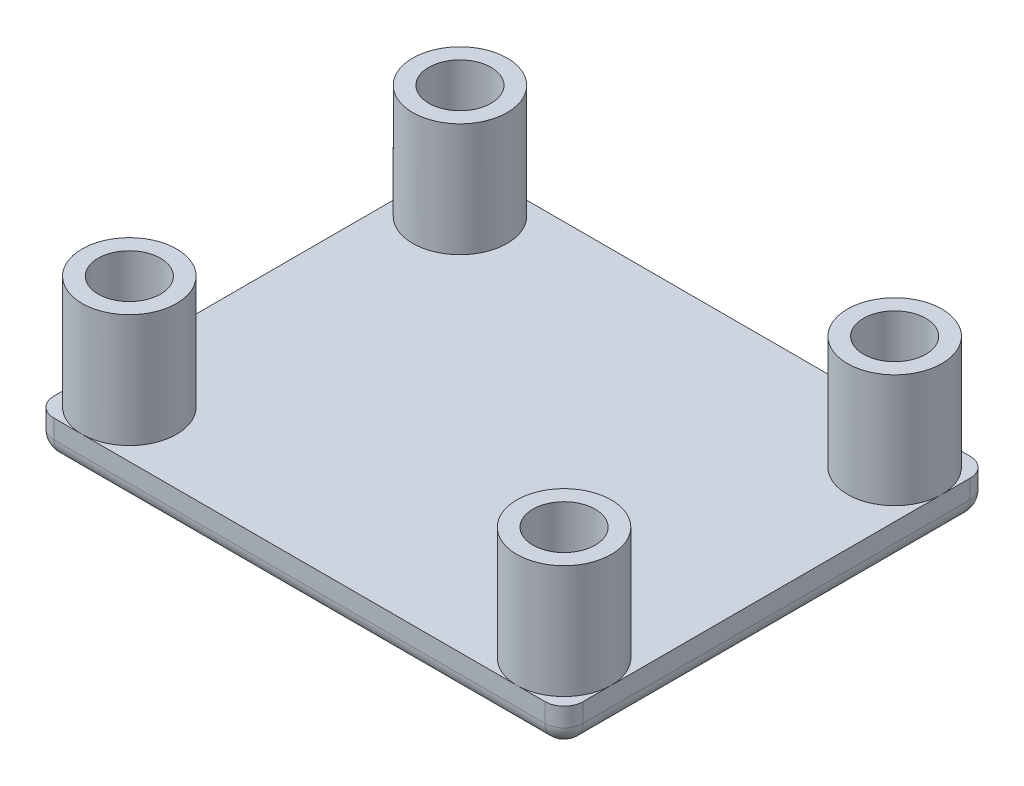
ISO-10303-21;
HEADER;
FILE_DESCRIPTION(('STEP AP214'),'2;1');
FILE_NAME('part.step','',(''),(''),'','','');
FILE_SCHEMA(('AUTOMOTIVE_DESIGN { 1 0 10303 214 1 1 1 1 }'));
ENDSEC;
DATA;
#1=APPLICATION_CONTEXT('core data for automotive mechanical design processes');
#2=APPLICATION_PROTOCOL_DEFINITION('international standard','automotive_design',2000,#1);
#3=PRODUCT_CONTEXT('',#1,'mechanical');
#4=PRODUCT('Part','Part','',(#3));
#5=PRODUCT_RELATED_PRODUCT_CATEGORY('part','',(#4));
#6=PRODUCT_DEFINITION_FORMATION('','',#4);
#7=PRODUCT_DEFINITION_CONTEXT('part definition',#1,'design');
#8=PRODUCT_DEFINITION('design','',#6,#7);
#9=PRODUCT_DEFINITION_SHAPE('','',#8);
#10=(LENGTH_UNIT() NAMED_UNIT(*) SI_UNIT(.MILLI.,.METRE.));
#11=(NAMED_UNIT(*) PLANE_ANGLE_UNIT() SI_UNIT($,.RADIAN.));
#12=(NAMED_UNIT(*) SI_UNIT($,.STERADIAN.) SOLID_ANGLE_UNIT());
#13=UNCERTAINTY_MEASURE_WITH_UNIT(LENGTH_MEASURE(1.E-05),#10,'distance_accuracy_value','');
#14=(GEOMETRIC_REPRESENTATION_CONTEXT(3) GLOBAL_UNCERTAINTY_ASSIGNED_CONTEXT((#13)) GLOBAL_UNIT_ASSIGNED_CONTEXT((#10,
#11,#12)) REPRESENTATION_CONTEXT('',''));
#15=CARTESIAN_POINT('',(0.,0.,0.));
#16=DIRECTION('',(0.,0.,1.));
#17=DIRECTION('',(1.,0.,0.));
#18=AXIS2_PLACEMENT_3D('',#15,#16,#17);
#19=CARTESIAN_POINT('',(0.,2.,0.));
#20=DIRECTION('',(0.,-1.,0.));
#21=DIRECTION('',(0.,0.,-1.));
#22=AXIS2_PLACEMENT_3D('',#19,#20,#21);
#23=PLANE('',#22);
#24=DIRECTION('',(0.,0.,1.));
#25=VECTOR('',#24,1.);
#26=CARTESIAN_POINT('',(-14.005,2.,11.25));
#27=LINE('',#26,#25);
#28=CARTESIAN_POINT('',(-14.005,2.,8.75));
#29=VERTEX_POINT('',#28);
#30=CARTESIAN_POINT('',(-14.005,2.,10.25));
#31=VERTEX_POINT('',#30);
#32=EDGE_CURVE('E149',#29,#31,#27,.T.);
#33=ORIENTED_EDGE('',*,*,#32,.T.);
#34=CARTESIAN_POINT('',(-13.005,2.,10.25));
#35=DIRECTION('',(0.,-1.,0.));
#36=DIRECTION('',(0.,0.,-1.));
#37=AXIS2_PLACEMENT_3D('',#34,#35,#36);
#38=CIRCLE('',#37,1.);
#39=CARTESIAN_POINT('',(-13.005,2.,11.25));
#40=VERTEX_POINT('',#39);
#41=EDGE_CURVE('E44',#31,#40,#38,.F.);
#42=ORIENTED_EDGE('',*,*,#41,.T.);
#43=DIRECTION('',(1.,0.,0.));
#44=VECTOR('',#43,1.);
#45=CARTESIAN_POINT('',(-14.005,2.,11.25));
#46=LINE('',#45,#44);
#47=CARTESIAN_POINT('',(-11.505,2.,11.25));
#48=VERTEX_POINT('',#47);
#49=EDGE_CURVE('E159',#40,#48,#46,.T.);
#50=ORIENTED_EDGE('',*,*,#49,.T.);
#51=CARTESIAN_POINT('',(-11.505,2.,8.75));
#52=DIRECTION('',(0.,1.,0.));
#53=DIRECTION('',(0.,0.,1.));
#54=AXIS2_PLACEMENT_3D('',#51,#52,#53);
#55=CIRCLE('',#54,2.5);
#56=EDGE_CURVE('E157',#29,#48,#55,.T.);
#57=ORIENTED_EDGE('',*,*,#56,.F.);
#58=EDGE_LOOP('',(#33,#42,#50,#57));
#59=FACE_BOUND('',#58,.T.);
#60=ADVANCED_FACE('F35',(#59),#23,.F.);
#61=CARTESIAN_POINT('',(11.505,2.,11.25));
#62=VERTEX_POINT('',#61);
#63=CARTESIAN_POINT('',(13.005,2.,11.25));
#64=VERTEX_POINT('',#63);
#65=EDGE_CURVE('E194',#62,#64,#46,.T.);
#66=ORIENTED_EDGE('',*,*,#65,.T.);
#67=CARTESIAN_POINT('',(13.005,2.,10.25));
#68=DIRECTION('',(0.,-1.,0.));
#69=DIRECTION('',(0.,0.,-1.));
#70=AXIS2_PLACEMENT_3D('',#67,#68,#69);
#71=CIRCLE('',#70,1.);
#72=CARTESIAN_POINT('',(14.005,2.,10.25));
#73=VERTEX_POINT('',#72);
#74=EDGE_CURVE('E257',#64,#73,#71,.F.);
#75=ORIENTED_EDGE('',*,*,#74,.T.);
#76=DIRECTION('',(0.,0.,-1.));
#77=VECTOR('',#76,1.);
#78=CARTESIAN_POINT('',(14.005,2.,11.25));
#79=LINE('',#78,#77);
#80=CARTESIAN_POINT('',(14.005,2.,8.75));
#81=VERTEX_POINT('',#80);
#82=EDGE_CURVE('E188',#73,#81,#79,.T.);
#83=ORIENTED_EDGE('',*,*,#82,.T.);
#84=CARTESIAN_POINT('',(11.505,2.,8.75));
#85=DIRECTION('',(0.,1.,0.));
#86=DIRECTION('',(0.,0.,1.));
#87=AXIS2_PLACEMENT_3D('',#84,#85,#86);
#88=CIRCLE('',#87,2.5);
#89=EDGE_CURVE('E174',#62,#81,#88,.T.);
#90=ORIENTED_EDGE('',*,*,#89,.F.);
#91=EDGE_LOOP('',(#66,#75,#83,#90));
#92=FACE_BOUND('',#91,.T.);
#93=ADVANCED_FACE('F328',(#92),#23,.F.);
#94=EDGE_CURVE('E143',#48,#29,#55,.T.);
#95=ORIENTED_EDGE('',*,*,#94,.F.);
#96=EDGE_CURVE('E196',#48,#62,#46,.T.);
#97=ORIENTED_EDGE('',*,*,#96,.T.);
#98=EDGE_CURVE('E166',#81,#62,#88,.T.);
#99=ORIENTED_EDGE('',*,*,#98,.F.);
#100=CARTESIAN_POINT('',(14.005,2.,-8.75));
#101=VERTEX_POINT('',#100);
#102=EDGE_CURVE('E191',#81,#101,#79,.T.);
#103=ORIENTED_EDGE('',*,*,#102,.T.);
#104=CARTESIAN_POINT('',(11.505,2.,-8.75));
#105=DIRECTION('',(0.,-1.,0.));
#106=DIRECTION('',(0.,0.,-1.));
#107=AXIS2_PLACEMENT_3D('',#104,#105,#106);
#108=CIRCLE('',#107,2.5);
#109=CARTESIAN_POINT('',(11.505,2.,-11.25));
#110=VERTEX_POINT('',#109);
#111=EDGE_CURVE('E197',#110,#101,#108,.F.);
#112=ORIENTED_EDGE('',*,*,#111,.F.);
#113=DIRECTION('',(-1.,0.,0.));
#114=VECTOR('',#113,1.);
#115=CARTESIAN_POINT('',(-14.005,2.,-11.25));
#116=LINE('',#115,#114);
#117=CARTESIAN_POINT('',(-11.505,2.,-11.25));
#118=VERTEX_POINT('',#117);
#119=EDGE_CURVE('E192',#110,#118,#116,.T.);
#120=ORIENTED_EDGE('',*,*,#119,.T.);
#121=CARTESIAN_POINT('',(-11.505,2.,-8.75));
#122=DIRECTION('',(0.,1.,0.));
#123=DIRECTION('',(0.,0.,1.));
#124=AXIS2_PLACEMENT_3D('',#121,#122,#123);
#125=CIRCLE('',#124,2.5);
#126=CARTESIAN_POINT('',(-14.005,2.,-8.75));
#127=VERTEX_POINT('',#126);
#128=EDGE_CURVE('E146',#127,#118,#125,.T.);
#129=ORIENTED_EDGE('',*,*,#128,.F.);
#130=EDGE_CURVE('E140',#127,#29,#27,.T.);
#131=ORIENTED_EDGE('',*,*,#130,.T.);
#132=EDGE_LOOP('',(#95,#97,#99,#103,#112,#120,#129,#131));
#133=FACE_BOUND('',#132,.T.);
#134=ADVANCED_FACE('F141',(#133),#23,.F.);
#135=CARTESIAN_POINT('',(-13.005,2.,-11.25));
#136=VERTEX_POINT('',#135);
#137=EDGE_CURVE('E190',#118,#136,#116,.T.);
#138=ORIENTED_EDGE('',*,*,#137,.T.);
#139=CARTESIAN_POINT('',(-13.005,2.,-10.25));
#140=DIRECTION('',(0.,-1.,0.));
#141=DIRECTION('',(0.,0.,-1.));
#142=AXIS2_PLACEMENT_3D('',#139,#140,#141);
#143=CIRCLE('',#142,1.);
#144=CARTESIAN_POINT('',(-14.005,2.,-10.25));
#145=VERTEX_POINT('',#144);
#146=EDGE_CURVE('E11',#136,#145,#143,.F.);
#147=ORIENTED_EDGE('',*,*,#146,.T.);
#148=EDGE_CURVE('E148',#145,#127,#27,.T.);
#149=ORIENTED_EDGE('',*,*,#148,.T.);
#150=EDGE_CURVE('E180',#118,#127,#125,.T.);
#151=ORIENTED_EDGE('',*,*,#150,.F.);
#152=EDGE_LOOP('',(#138,#147,#149,#151));
#153=FACE_BOUND('',#152,.T.);
#154=ADVANCED_FACE('F368',(#153),#23,.F.);
#155=CARTESIAN_POINT('',(14.005,2.,11.25));
#156=DIRECTION('',(-1.,0.,0.));
#157=DIRECTION('',(0.,0.,1.));
#158=AXIS2_PLACEMENT_3D('',#155,#156,#157);
#159=PLANE('',#158);
#160=DIRECTION('',(0.,0.,-1.));
#161=VECTOR('',#160,1.);
#162=CARTESIAN_POINT('',(14.005,1.,-11.25));
#163=LINE('',#162,#161);
#164=CARTESIAN_POINT('',(14.005,1.,10.25));
#165=VERTEX_POINT('',#164);
#166=CARTESIAN_POINT('',(14.005,1.,-10.25));
#167=VERTEX_POINT('',#166);
#168=EDGE_CURVE('E200',#165,#167,#163,.T.);
#169=ORIENTED_EDGE('',*,*,#168,.T.);
#170=DIRECTION('',(0.,-1.,0.));
#171=VECTOR('',#170,1.);
#172=CARTESIAN_POINT('',(14.005,2.,-10.25));
#173=LINE('',#172,#171);
#174=CARTESIAN_POINT('',(14.005,2.,-10.25));
#175=VERTEX_POINT('',#174);
#176=EDGE_CURVE('E249',#167,#175,#173,.F.);
#177=ORIENTED_EDGE('',*,*,#176,.T.);
#178=EDGE_CURVE('E186',#101,#175,#79,.T.);
#179=ORIENTED_EDGE('',*,*,#178,.F.);
#180=ORIENTED_EDGE('',*,*,#102,.F.);
#181=ORIENTED_EDGE('',*,*,#82,.F.);
#182=DIRECTION('',(0.,-1.,0.));
#183=VECTOR('',#182,1.);
#184=CARTESIAN_POINT('',(14.005,2.,10.25));
#185=LINE('',#184,#183);
#186=EDGE_CURVE('E247',#73,#165,#185,.T.);
#187=ORIENTED_EDGE('',*,*,#186,.T.);
#188=EDGE_LOOP('',(#169,#177,#179,#180,#181,#187));
#189=FACE_BOUND('',#188,.T.);
#190=ADVANCED_FACE('F336',(#189),#159,.F.);
#191=CARTESIAN_POINT('',(-14.005,2.,-11.25));
#192=DIRECTION('',(0.,0.,1.));
#193=DIRECTION('',(1.,0.,0.));
#194=AXIS2_PLACEMENT_3D('',#191,#192,#193);
#195=PLANE('',#194);
#196=CARTESIAN_POINT('',(13.005,2.,-11.25));
#197=VERTEX_POINT('',#196);
#198=EDGE_CURVE('E155',#197,#110,#116,.T.);
#199=ORIENTED_EDGE('',*,*,#198,.F.);
#200=DIRECTION('',(0.,-1.,0.));
#201=VECTOR('',#200,1.);
#202=CARTESIAN_POINT('',(13.005,2.,-11.25));
#203=LINE('',#202,#201);
#204=CARTESIAN_POINT('',(13.005,1.,-11.25));
#205=VERTEX_POINT('',#204);
#206=EDGE_CURVE('E245',#197,#205,#203,.T.);
#207=ORIENTED_EDGE('',*,*,#206,.T.);
#208=DIRECTION('',(-1.,0.,0.));
#209=VECTOR('',#208,1.);
#210=CARTESIAN_POINT('',(-14.005,1.,-11.25));
#211=LINE('',#210,#209);
#212=CARTESIAN_POINT('',(-13.005,1.,-11.25));
#213=VERTEX_POINT('',#212);
#214=EDGE_CURVE('E215',#205,#213,#211,.T.);
#215=ORIENTED_EDGE('',*,*,#214,.T.);
#216=DIRECTION('',(0.,-1.,0.));
#217=VECTOR('',#216,1.);
#218=CARTESIAN_POINT('',(-13.005,2.,-11.25));
#219=LINE('',#218,#217);
#220=EDGE_CURVE('E243',#213,#136,#219,.F.);
#221=ORIENTED_EDGE('',*,*,#220,.T.);
#222=ORIENTED_EDGE('',*,*,#137,.F.);
#223=ORIENTED_EDGE('',*,*,#119,.F.);
#224=EDGE_LOOP('',(#199,#207,#215,#221,#222,#223));
#225=FACE_BOUND('',#224,.T.);
#226=ADVANCED_FACE('F289',(#225),#195,.F.);
#227=CARTESIAN_POINT('',(-14.005,2.,11.25));
#228=DIRECTION('',(1.,0.,0.));
#229=DIRECTION('',(0.,0.,-1.));
#230=AXIS2_PLACEMENT_3D('',#227,#228,#229);
#231=PLANE('',#230);
#232=DIRECTION('',(0.,0.,1.));
#233=VECTOR('',#232,1.);
#234=CARTESIAN_POINT('',(-14.005,1.,11.25));
#235=LINE('',#234,#233);
#236=CARTESIAN_POINT('',(-14.005,1.,-10.25));
#237=VERTEX_POINT('',#236);
#238=CARTESIAN_POINT('',(-14.005,1.,10.25));
#239=VERTEX_POINT('',#238);
#240=EDGE_CURVE('E218',#237,#239,#235,.T.);
#241=ORIENTED_EDGE('',*,*,#240,.T.);
#242=DIRECTION('',(0.,-1.,0.));
#243=VECTOR('',#242,1.);
#244=CARTESIAN_POINT('',(-14.005,2.,10.25));
#245=LINE('',#244,#243);
#246=EDGE_CURVE('E58',#239,#31,#245,.F.);
#247=ORIENTED_EDGE('',*,*,#246,.T.);
#248=ORIENTED_EDGE('',*,*,#32,.F.);
#249=ORIENTED_EDGE('',*,*,#130,.F.);
#250=ORIENTED_EDGE('',*,*,#148,.F.);
#251=DIRECTION('',(0.,-1.,0.));
#252=VECTOR('',#251,1.);
#253=CARTESIAN_POINT('',(-14.005,2.,-10.25));
#254=LINE('',#253,#252);
#255=EDGE_CURVE('E259',#145,#237,#254,.T.);
#256=ORIENTED_EDGE('',*,*,#255,.T.);
#257=EDGE_LOOP('',(#241,#247,#248,#249,#250,#256));
#258=FACE_BOUND('',#257,.T.);
#259=ADVANCED_FACE('F152',(#258),#231,.F.);
#260=CARTESIAN_POINT('',(-14.005,2.,11.25));
#261=DIRECTION('',(0.,0.,-1.));
#262=DIRECTION('',(-1.,0.,0.));
#263=AXIS2_PLACEMENT_3D('',#260,#261,#262);
#264=PLANE('',#263);
#265=DIRECTION('',(1.,0.,0.));
#266=VECTOR('',#265,1.);
#267=CARTESIAN_POINT('',(14.005,1.,11.25));
#268=LINE('',#267,#266);
#269=CARTESIAN_POINT('',(-13.005,1.,11.25));
#270=VERTEX_POINT('',#269);
#271=CARTESIAN_POINT('',(13.005,1.,11.25));
#272=VERTEX_POINT('',#271);
#273=EDGE_CURVE('E220',#270,#272,#268,.T.);
#274=ORIENTED_EDGE('',*,*,#273,.T.);
#275=DIRECTION('',(0.,-1.,0.));
#276=VECTOR('',#275,1.);
#277=CARTESIAN_POINT('',(13.005,2.,11.25));
#278=LINE('',#277,#276);
#279=EDGE_CURVE('E255',#272,#64,#278,.F.);
#280=ORIENTED_EDGE('',*,*,#279,.T.);
#281=ORIENTED_EDGE('',*,*,#65,.F.);
#282=ORIENTED_EDGE('',*,*,#96,.F.);
#283=ORIENTED_EDGE('',*,*,#49,.F.);
#284=DIRECTION('',(0.,-1.,0.));
#285=VECTOR('',#284,1.);
#286=CARTESIAN_POINT('',(-13.005,2.,11.25));
#287=LINE('',#286,#285);
#288=EDGE_CURVE('E253',#40,#270,#287,.T.);
#289=ORIENTED_EDGE('',*,*,#288,.T.);
#290=EDGE_LOOP('',(#274,#280,#281,#282,#283,#289));
#291=FACE_BOUND('',#290,.T.);
#292=ADVANCED_FACE('F321',(#291),#264,.F.);
#293=ORIENTED_EDGE('',*,*,#178,.T.);
#294=CARTESIAN_POINT('',(13.005,2.,-10.25));
#295=DIRECTION('',(0.,-1.,0.));
#296=DIRECTION('',(0.,0.,-1.));
#297=AXIS2_PLACEMENT_3D('',#294,#295,#296);
#298=CIRCLE('',#297,1.);
#299=EDGE_CURVE('E251',#175,#197,#298,.F.);
#300=ORIENTED_EDGE('',*,*,#299,.T.);
#301=ORIENTED_EDGE('',*,*,#198,.T.);
#302=CARTESIAN_POINT('',(11.505,2.,-8.75));
#303=DIRECTION('',(0.,1.,0.));
#304=DIRECTION('',(0.,0.,1.));
#305=AXIS2_PLACEMENT_3D('',#302,#303,#304);
#306=CIRCLE('',#305,2.5);
#307=EDGE_CURVE('E173',#101,#110,#306,.T.);
#308=ORIENTED_EDGE('',*,*,#307,.F.);
#309=EDGE_LOOP('',(#293,#300,#301,#308));
#310=FACE_BOUND('',#309,.T.);
#311=ADVANCED_FACE('F360',(#310),#23,.F.);
#312=CARTESIAN_POINT('',(0.,0.,0.));
#313=DIRECTION('',(0.,-1.,0.));
#314=DIRECTION('',(0.,0.,-1.));
#315=AXIS2_PLACEMENT_3D('',#312,#313,#314);
#316=PLANE('',#315);
#317=DIRECTION('',(-1.,0.,0.));
#318=VECTOR('',#317,1.);
#319=CARTESIAN_POINT('',(14.005,0.,-10.25));
#320=LINE('',#319,#318);
#321=CARTESIAN_POINT('',(-13.005,0.,-10.25));
#322=VERTEX_POINT('',#321);
#323=CARTESIAN_POINT('',(13.005,0.,-10.25));
#324=VERTEX_POINT('',#323);
#325=EDGE_CURVE('E209',#322,#324,#320,.F.);
#326=ORIENTED_EDGE('',*,*,#325,.T.);
#327=DIRECTION('',(0.,0.,-1.));
#328=VECTOR('',#327,1.);
#329=CARTESIAN_POINT('',(13.005,0.,11.25));
#330=LINE('',#329,#328);
#331=CARTESIAN_POINT('',(13.005,0.,10.25));
#332=VERTEX_POINT('',#331);
#333=EDGE_CURVE('E212',#324,#332,#330,.F.);
#334=ORIENTED_EDGE('',*,*,#333,.T.);
#335=DIRECTION('',(1.,0.,0.));
#336=VECTOR('',#335,1.);
#337=CARTESIAN_POINT('',(-14.005,0.,10.25));
#338=LINE('',#337,#336);
#339=CARTESIAN_POINT('',(-13.005,0.,10.25));
#340=VERTEX_POINT('',#339);
#341=EDGE_CURVE('E203',#332,#340,#338,.F.);
#342=ORIENTED_EDGE('',*,*,#341,.T.);
#343=DIRECTION('',(0.,0.,1.));
#344=VECTOR('',#343,1.);
#345=CARTESIAN_POINT('',(-13.005,0.,-11.25));
#346=LINE('',#345,#344);
#347=EDGE_CURVE('E206',#340,#322,#346,.F.);
#348=ORIENTED_EDGE('',*,*,#347,.T.);
#349=EDGE_LOOP('',(#326,#334,#342,#348));
#350=FACE_BOUND('',#349,.T.);
#351=ADVANCED_FACE('F302',(#350),#316,.T.);
#352=CARTESIAN_POINT('',(-11.505,8.,-8.75));
#353=DIRECTION('',(0.,-1.,0.));
#354=DIRECTION('',(0.,0.,-1.));
#355=AXIS2_PLACEMENT_3D('',#352,#353,#354);
#356=CYLINDRICAL_SURFACE('',#355,2.5);
#357=CARTESIAN_POINT('',(-11.505,8.,-8.75));
#358=DIRECTION('',(0.,1.,0.));
#359=DIRECTION('',(0.,0.,1.));
#360=AXIS2_PLACEMENT_3D('',#357,#358,#359);
#361=CIRCLE('',#360,2.5);
#362=CARTESIAN_POINT('',(-11.505,8.,-6.25));
#363=VERTEX_POINT('',#362);
#364=EDGE_CURVE('E183',#363,#363,#361,.T.);
#365=ORIENTED_EDGE('',*,*,#364,.F.);
#366=EDGE_LOOP('',(#365));
#367=FACE_BOUND('',#366,.T.);
#368=ORIENTED_EDGE('',*,*,#150,.T.);
#369=ORIENTED_EDGE('',*,*,#128,.T.);
#370=EDGE_LOOP('',(#368,#369));
#371=FACE_BOUND('',#370,.T.);
#372=ADVANCED_FACE('F373',(#367,#371),#356,.T.);
#373=CARTESIAN_POINT('',(-11.505,8.,-8.75));
#374=DIRECTION('',(0.,1.,0.));
#375=DIRECTION('',(0.,0.,1.));
#376=AXIS2_PLACEMENT_3D('',#373,#374,#375);
#377=PLANE('',#376);
#378=CARTESIAN_POINT('',(-11.505,8.,-8.75));
#379=DIRECTION('',(0.,1.,0.));
#380=DIRECTION('',(0.,0.,1.));
#381=AXIS2_PLACEMENT_3D('',#378,#379,#380);
#382=CIRCLE('',#381,1.65);
#383=CARTESIAN_POINT('',(-11.505,8.,-7.1));
#384=VERTEX_POINT('',#383);
#385=EDGE_CURVE('E689',#384,#384,#382,.T.);
#386=ORIENTED_EDGE('',*,*,#385,.F.);
#387=EDGE_LOOP('',(#386));
#388=FACE_BOUND('',#387,.T.);
#389=ORIENTED_EDGE('',*,*,#364,.T.);
#390=EDGE_LOOP('',(#389));
#391=FACE_BOUND('',#390,.T.);
#392=ADVANCED_FACE('F385',(#388,#391),#377,.T.);
#393=CARTESIAN_POINT('',(11.505,8.,-8.75));
#394=DIRECTION('',(0.,-1.,0.));
#395=DIRECTION('',(0.,0.,-1.));
#396=AXIS2_PLACEMENT_3D('',#393,#394,#395);
#397=CYLINDRICAL_SURFACE('',#396,2.5);
#398=CARTESIAN_POINT('',(11.505,8.,-8.75));
#399=DIRECTION('',(0.,1.,0.));
#400=DIRECTION('',(0.,0.,1.));
#401=AXIS2_PLACEMENT_3D('',#398,#399,#400);
#402=CIRCLE('',#401,2.5);
#403=CARTESIAN_POINT('',(11.505,8.,-6.25));
#404=VERTEX_POINT('',#403);
#405=EDGE_CURVE('E177',#404,#404,#402,.T.);
#406=ORIENTED_EDGE('',*,*,#405,.F.);
#407=EDGE_LOOP('',(#406));
#408=FACE_BOUND('',#407,.T.);
#409=ORIENTED_EDGE('',*,*,#307,.T.);
#410=ORIENTED_EDGE('',*,*,#111,.T.);
#411=EDGE_LOOP('',(#409,#410));
#412=FACE_BOUND('',#411,.T.);
#413=ADVANCED_FACE('F354',(#408,#412),#397,.T.);
#414=CARTESIAN_POINT('',(11.505,8.,-8.75));
#415=DIRECTION('',(0.,1.,0.));
#416=DIRECTION('',(0.,0.,1.));
#417=AXIS2_PLACEMENT_3D('',#414,#415,#416);
#418=PLANE('',#417);
#419=CARTESIAN_POINT('',(11.505,8.,-8.75));
#420=DIRECTION('',(0.,1.,0.));
#421=DIRECTION('',(0.,0.,1.));
#422=AXIS2_PLACEMENT_3D('',#419,#420,#421);
#423=CIRCLE('',#422,1.65);
#424=CARTESIAN_POINT('',(11.505,8.,-7.1));
#425=VERTEX_POINT('',#424);
#426=EDGE_CURVE('E690',#425,#425,#423,.T.);
#427=ORIENTED_EDGE('',*,*,#426,.F.);
#428=EDGE_LOOP('',(#427));
#429=FACE_BOUND('',#428,.T.);
#430=ORIENTED_EDGE('',*,*,#405,.T.);
#431=EDGE_LOOP('',(#430));
#432=FACE_BOUND('',#431,.T.);
#433=ADVANCED_FACE('F345',(#429,#432),#418,.T.);
#434=CARTESIAN_POINT('',(11.505,8.,8.75));
#435=DIRECTION('',(0.,-1.,0.));
#436=DIRECTION('',(0.,0.,-1.));
#437=AXIS2_PLACEMENT_3D('',#434,#435,#436);
#438=CYLINDRICAL_SURFACE('',#437,2.5);
#439=CARTESIAN_POINT('',(11.505,8.,8.75));
#440=DIRECTION('',(0.,1.,0.));
#441=DIRECTION('',(0.,0.,1.));
#442=AXIS2_PLACEMENT_3D('',#439,#440,#441);
#443=CIRCLE('',#442,2.5);
#444=CARTESIAN_POINT('',(11.505,8.,11.25));
#445=VERTEX_POINT('',#444);
#446=EDGE_CURVE('E170',#445,#445,#443,.T.);
#447=ORIENTED_EDGE('',*,*,#446,.F.);
#448=EDGE_LOOP('',(#447));
#449=FACE_BOUND('',#448,.T.);
#450=ORIENTED_EDGE('',*,*,#89,.T.);
#451=ORIENTED_EDGE('',*,*,#98,.T.);
#452=EDGE_LOOP('',(#450,#451));
#453=FACE_BOUND('',#452,.T.);
#454=ADVANCED_FACE('F342',(#449,#453),#438,.T.);
#455=CARTESIAN_POINT('',(11.505,8.,8.75));
#456=DIRECTION('',(0.,1.,0.));
#457=DIRECTION('',(0.,0.,1.));
#458=AXIS2_PLACEMENT_3D('',#455,#456,#457);
#459=PLANE('',#458);
#460=CARTESIAN_POINT('',(11.505,8.,8.75));
#461=DIRECTION('',(0.,1.,0.));
#462=DIRECTION('',(0.,0.,1.));
#463=AXIS2_PLACEMENT_3D('',#460,#461,#462);
#464=CIRCLE('',#463,1.65);
#465=CARTESIAN_POINT('',(11.505,8.,10.4));
#466=VERTEX_POINT('',#465);
#467=EDGE_CURVE('E699',#466,#466,#464,.T.);
#468=ORIENTED_EDGE('',*,*,#467,.F.);
#469=EDGE_LOOP('',(#468));
#470=FACE_BOUND('',#469,.T.);
#471=ORIENTED_EDGE('',*,*,#446,.T.);
#472=EDGE_LOOP('',(#471));
#473=FACE_BOUND('',#472,.T.);
#474=ADVANCED_FACE('F344',(#470,#473),#459,.T.);
#475=CARTESIAN_POINT('',(-11.505,8.,8.75));
#476=DIRECTION('',(0.,-1.,0.));
#477=DIRECTION('',(0.,0.,-1.));
#478=AXIS2_PLACEMENT_3D('',#475,#476,#477);
#479=CYLINDRICAL_SURFACE('',#478,2.5);
#480=CARTESIAN_POINT('',(-11.505,8.,8.75));
#481=DIRECTION('',(0.,1.,0.));
#482=DIRECTION('',(0.,0.,1.));
#483=AXIS2_PLACEMENT_3D('',#480,#481,#482);
#484=CIRCLE('',#483,2.5);
#485=CARTESIAN_POINT('',(-11.505,8.,11.25));
#486=VERTEX_POINT('',#485);
#487=EDGE_CURVE('E164',#486,#486,#484,.T.);
#488=ORIENTED_EDGE('',*,*,#487,.F.);
#489=EDGE_LOOP('',(#488));
#490=FACE_BOUND('',#489,.T.);
#491=ORIENTED_EDGE('',*,*,#94,.T.);
#492=ORIENTED_EDGE('',*,*,#56,.T.);
#493=EDGE_LOOP('',(#491,#492));
#494=FACE_BOUND('',#493,.T.);
#495=ADVANCED_FACE('F163',(#490,#494),#479,.T.);
#496=CARTESIAN_POINT('',(-11.505,8.,8.75));
#497=DIRECTION('',(0.,1.,0.));
#498=DIRECTION('',(0.,0.,1.));
#499=AXIS2_PLACEMENT_3D('',#496,#497,#498);
#500=PLANE('',#499);
#501=CARTESIAN_POINT('',(-11.505,8.,8.75));
#502=DIRECTION('',(0.,1.,0.));
#503=DIRECTION('',(0.,0.,1.));
#504=AXIS2_PLACEMENT_3D('',#501,#502,#503);
#505=CIRCLE('',#504,1.65);
#506=CARTESIAN_POINT('',(-11.505,8.,10.4));
#507=VERTEX_POINT('',#506);
#508=EDGE_CURVE('E265',#507,#507,#505,.T.);
#509=ORIENTED_EDGE('',*,*,#508,.F.);
#510=EDGE_LOOP('',(#509));
#511=FACE_BOUND('',#510,.T.);
#512=ORIENTED_EDGE('',*,*,#487,.T.);
#513=EDGE_LOOP('',(#512));
#514=FACE_BOUND('',#513,.T.);
#515=ADVANCED_FACE('F431',(#511,#514),#500,.T.);
#516=CARTESIAN_POINT('',(-11.505,3.,-8.75));
#517=DIRECTION('',(0.,1.,0.));
#518=DIRECTION('',(0.,0.,1.));
#519=AXIS2_PLACEMENT_3D('',#516,#517,#518);
#520=CYLINDRICAL_SURFACE('',#519,1.65);
#521=CARTESIAN_POINT('',(-11.505,3.,-8.75));
#522=DIRECTION('',(0.,1.,0.));
#523=DIRECTION('',(0.,0.,1.));
#524=AXIS2_PLACEMENT_3D('',#521,#522,#523);
#525=CIRCLE('',#524,1.65);
#526=CARTESIAN_POINT('',(-11.505,3.,-7.1));
#527=VERTEX_POINT('',#526);
#528=EDGE_CURVE('E161',#527,#527,#525,.T.);
#529=ORIENTED_EDGE('',*,*,#528,.F.);
#530=EDGE_LOOP('',(#529));
#531=FACE_BOUND('',#530,.T.);
#532=ORIENTED_EDGE('',*,*,#385,.T.);
#533=EDGE_LOOP('',(#532));
#534=FACE_BOUND('',#533,.T.);
#535=ADVANCED_FACE('F436',(#531,#534),#520,.F.);
#536=CARTESIAN_POINT('',(-11.505,3.,-8.75));
#537=DIRECTION('',(0.,1.,0.));
#538=DIRECTION('',(0.,0.,1.));
#539=AXIS2_PLACEMENT_3D('',#536,#537,#538);
#540=PLANE('',#539);
#541=ORIENTED_EDGE('',*,*,#528,.T.);
#542=EDGE_LOOP('',(#541));
#543=FACE_BOUND('',#542,.T.);
#544=ADVANCED_FACE('F446',(#543),#540,.T.);
#545=CARTESIAN_POINT('',(-11.505,3.,8.75));
#546=DIRECTION('',(0.,1.,0.));
#547=DIRECTION('',(0.,0.,1.));
#548=AXIS2_PLACEMENT_3D('',#545,#546,#547);
#549=CYLINDRICAL_SURFACE('',#548,1.65);
#550=CARTESIAN_POINT('',(-11.505,3.,8.75));
#551=DIRECTION('',(0.,1.,0.));
#552=DIRECTION('',(0.,0.,1.));
#553=AXIS2_PLACEMENT_3D('',#550,#551,#552);
#554=CIRCLE('',#553,1.65);
#555=CARTESIAN_POINT('',(-11.505,3.,10.4));
#556=VERTEX_POINT('',#555);
#557=EDGE_CURVE('E702',#556,#556,#554,.T.);
#558=ORIENTED_EDGE('',*,*,#557,.F.);
#559=EDGE_LOOP('',(#558));
#560=FACE_BOUND('',#559,.T.);
#561=ORIENTED_EDGE('',*,*,#508,.T.);
#562=EDGE_LOOP('',(#561));
#563=FACE_BOUND('',#562,.T.);
#564=ADVANCED_FACE('F456',(#560,#563),#549,.F.);
#565=CARTESIAN_POINT('',(-11.505,3.,8.75));
#566=DIRECTION('',(0.,1.,0.));
#567=DIRECTION('',(0.,0.,1.));
#568=AXIS2_PLACEMENT_3D('',#565,#566,#567);
#569=PLANE('',#568);
#570=ORIENTED_EDGE('',*,*,#557,.T.);
#571=EDGE_LOOP('',(#570));
#572=FACE_BOUND('',#571,.T.);
#573=ADVANCED_FACE('F466',(#572),#569,.T.);
#574=CARTESIAN_POINT('',(11.505,3.,8.75));
#575=DIRECTION('',(0.,1.,0.));
#576=DIRECTION('',(0.,0.,1.));
#577=AXIS2_PLACEMENT_3D('',#574,#575,#576);
#578=CYLINDRICAL_SURFACE('',#577,1.65);
#579=CARTESIAN_POINT('',(11.505,3.,8.75));
#580=DIRECTION('',(0.,1.,0.));
#581=DIRECTION('',(0.,0.,1.));
#582=AXIS2_PLACEMENT_3D('',#579,#580,#581);
#583=CIRCLE('',#582,1.65);
#584=CARTESIAN_POINT('',(11.505,3.,10.4));
#585=VERTEX_POINT('',#584);
#586=EDGE_CURVE('E694',#585,#585,#583,.T.);
#587=ORIENTED_EDGE('',*,*,#586,.F.);
#588=EDGE_LOOP('',(#587));
#589=FACE_BOUND('',#588,.T.);
#590=ORIENTED_EDGE('',*,*,#467,.T.);
#591=EDGE_LOOP('',(#590));
#592=FACE_BOUND('',#591,.T.);
#593=ADVANCED_FACE('F476',(#589,#592),#578,.F.);
#594=CARTESIAN_POINT('',(11.505,3.,8.75));
#595=DIRECTION('',(0.,1.,0.));
#596=DIRECTION('',(0.,0.,1.));
#597=AXIS2_PLACEMENT_3D('',#594,#595,#596);
#598=PLANE('',#597);
#599=ORIENTED_EDGE('',*,*,#586,.T.);
#600=EDGE_LOOP('',(#599));
#601=FACE_BOUND('',#600,.T.);
#602=ADVANCED_FACE('F486',(#601),#598,.T.);
#603=CARTESIAN_POINT('',(11.505,3.,-8.75));
#604=DIRECTION('',(0.,1.,0.));
#605=DIRECTION('',(0.,0.,1.));
#606=AXIS2_PLACEMENT_3D('',#603,#604,#605);
#607=CYLINDRICAL_SURFACE('',#606,1.65);
#608=CARTESIAN_POINT('',(11.505,3.,-8.75));
#609=DIRECTION('',(0.,1.,0.));
#610=DIRECTION('',(0.,0.,1.));
#611=AXIS2_PLACEMENT_3D('',#608,#609,#610);
#612=CIRCLE('',#611,1.65);
#613=CARTESIAN_POINT('',(11.505,3.,-7.1));
#614=VERTEX_POINT('',#613);
#615=EDGE_CURVE('E688',#614,#614,#612,.T.);
#616=ORIENTED_EDGE('',*,*,#615,.F.);
#617=EDGE_LOOP('',(#616));
#618=FACE_BOUND('',#617,.T.);
#619=ORIENTED_EDGE('',*,*,#426,.T.);
#620=EDGE_LOOP('',(#619));
#621=FACE_BOUND('',#620,.T.);
#622=ADVANCED_FACE('F496',(#618,#621),#607,.F.);
#623=CARTESIAN_POINT('',(11.505,3.,-8.75));
#624=DIRECTION('',(0.,1.,0.));
#625=DIRECTION('',(0.,0.,1.));
#626=AXIS2_PLACEMENT_3D('',#623,#624,#625);
#627=PLANE('',#626);
#628=ORIENTED_EDGE('',*,*,#615,.T.);
#629=EDGE_LOOP('',(#628));
#630=FACE_BOUND('',#629,.T.);
#631=ADVANCED_FACE('F506',(#630),#627,.T.);
#632=CARTESIAN_POINT('',(-13.005,1.,11.25));
#633=DIRECTION('',(0.,0.,-1.));
#634=DIRECTION('',(-1.,0.,0.));
#635=AXIS2_PLACEMENT_3D('',#632,#633,#634);
#636=CYLINDRICAL_SURFACE('',#635,1.);
#637=ORIENTED_EDGE('',*,*,#347,.F.);
#638=CARTESIAN_POINT('',(-13.005,1.,10.25));
#639=DIRECTION('',(0.,0.,-1.));
#640=DIRECTION('',(-1.,0.,0.));
#641=AXIS2_PLACEMENT_3D('',#638,#639,#640);
#642=CIRCLE('',#641,1.);
#643=EDGE_CURVE('E241',#340,#239,#642,.T.);
#644=ORIENTED_EDGE('',*,*,#643,.T.);
#645=ORIENTED_EDGE('',*,*,#240,.F.);
#646=CARTESIAN_POINT('',(-13.005,1.,-10.25));
#647=DIRECTION('',(0.,0.,-1.));
#648=DIRECTION('',(-1.,0.,0.));
#649=AXIS2_PLACEMENT_3D('',#646,#647,#648);
#650=CIRCLE('',#649,1.);
#651=EDGE_CURVE('E239',#237,#322,#650,.F.);
#652=ORIENTED_EDGE('',*,*,#651,.T.);
#653=EDGE_LOOP('',(#637,#644,#645,#652));
#654=FACE_BOUND('',#653,.T.);
#655=ADVANCED_FACE('F315',(#654),#636,.T.);
#656=CARTESIAN_POINT('',(-14.005,1.,10.25));
#657=DIRECTION('',(-1.,0.,0.));
#658=DIRECTION('',(0.,0.,1.));
#659=AXIS2_PLACEMENT_3D('',#656,#657,#658);
#660=CYLINDRICAL_SURFACE('',#659,1.);
#661=ORIENTED_EDGE('',*,*,#341,.F.);
#662=CARTESIAN_POINT('',(13.005,1.,10.25));
#663=DIRECTION('',(-1.,0.,0.));
#664=DIRECTION('',(0.,0.,1.));
#665=AXIS2_PLACEMENT_3D('',#662,#663,#664);
#666=CIRCLE('',#665,1.);
#667=EDGE_CURVE('E237',#332,#272,#666,.T.);
#668=ORIENTED_EDGE('',*,*,#667,.T.);
#669=ORIENTED_EDGE('',*,*,#273,.F.);
#670=CARTESIAN_POINT('',(-13.005,1.,10.25));
#671=DIRECTION('',(-1.,0.,0.));
#672=DIRECTION('',(0.,0.,1.));
#673=AXIS2_PLACEMENT_3D('',#670,#671,#672);
#674=CIRCLE('',#673,1.);
#675=EDGE_CURVE('E234',#270,#340,#674,.F.);
#676=ORIENTED_EDGE('',*,*,#675,.T.);
#677=EDGE_LOOP('',(#661,#668,#669,#676));
#678=FACE_BOUND('',#677,.T.);
#679=ADVANCED_FACE('F312',(#678),#660,.T.);
#680=CARTESIAN_POINT('',(-14.005,1.,-10.25));
#681=DIRECTION('',(1.,0.,0.));
#682=DIRECTION('',(0.,0.,-1.));
#683=AXIS2_PLACEMENT_3D('',#680,#681,#682);
#684=CYLINDRICAL_SURFACE('',#683,1.);
#685=ORIENTED_EDGE('',*,*,#214,.F.);
#686=CARTESIAN_POINT('',(13.005,1.,-10.25));
#687=DIRECTION('',(1.,0.,0.));
#688=DIRECTION('',(0.,0.,-1.));
#689=AXIS2_PLACEMENT_3D('',#686,#687,#688);
#690=CIRCLE('',#689,1.);
#691=EDGE_CURVE('E232',#205,#324,#690,.F.);
#692=ORIENTED_EDGE('',*,*,#691,.T.);
#693=ORIENTED_EDGE('',*,*,#325,.F.);
#694=CARTESIAN_POINT('',(-13.005,1.,-10.25));
#695=DIRECTION('',(1.,0.,0.));
#696=DIRECTION('',(0.,0.,-1.));
#697=AXIS2_PLACEMENT_3D('',#694,#695,#696);
#698=CIRCLE('',#697,1.);
#699=EDGE_CURVE('E229',#322,#213,#698,.T.);
#700=ORIENTED_EDGE('',*,*,#699,.T.);
#701=EDGE_LOOP('',(#685,#692,#693,#700));
#702=FACE_BOUND('',#701,.T.);
#703=ADVANCED_FACE('F286',(#702),#684,.T.);
#704=CARTESIAN_POINT('',(13.005,1.,11.25));
#705=DIRECTION('',(0.,0.,1.));
#706=DIRECTION('',(1.,0.,0.));
#707=AXIS2_PLACEMENT_3D('',#704,#705,#706);
#708=CYLINDRICAL_SURFACE('',#707,1.);
#709=ORIENTED_EDGE('',*,*,#333,.F.);
#710=CARTESIAN_POINT('',(13.005,1.,-10.25));
#711=DIRECTION('',(0.,0.,1.));
#712=DIRECTION('',(1.,0.,0.));
#713=AXIS2_PLACEMENT_3D('',#710,#711,#712);
#714=CIRCLE('',#713,1.);
#715=EDGE_CURVE('E226',#324,#167,#714,.T.);
#716=ORIENTED_EDGE('',*,*,#715,.T.);
#717=ORIENTED_EDGE('',*,*,#168,.F.);
#718=CARTESIAN_POINT('',(13.005,1.,10.25));
#719=DIRECTION('',(0.,0.,1.));
#720=DIRECTION('',(1.,0.,0.));
#721=AXIS2_PLACEMENT_3D('',#718,#719,#720);
#722=CIRCLE('',#721,1.);
#723=EDGE_CURVE('E223',#165,#332,#722,.F.);
#724=ORIENTED_EDGE('',*,*,#723,.T.);
#725=EDGE_LOOP('',(#709,#716,#717,#724));
#726=FACE_BOUND('',#725,.T.);
#727=ADVANCED_FACE('F305',(#726),#708,.T.);
#728=CARTESIAN_POINT('',(13.005,2.,-10.25));
#729=DIRECTION('',(0.,-1.,0.));
#730=DIRECTION('',(0.,0.,-1.));
#731=AXIS2_PLACEMENT_3D('',#728,#729,#730);
#732=CYLINDRICAL_SURFACE('',#731,1.);
#733=ORIENTED_EDGE('',*,*,#299,.F.);
#734=ORIENTED_EDGE('',*,*,#176,.F.);
#735=CARTESIAN_POINT('',(13.005,1.,-10.25));
#736=DIRECTION('',(0.,-1.,0.));
#737=DIRECTION('',(0.,0.,-1.));
#738=AXIS2_PLACEMENT_3D('',#735,#736,#737);
#739=CIRCLE('',#738,1.);
#740=EDGE_CURVE('E263',#205,#167,#739,.T.);
#741=ORIENTED_EDGE('',*,*,#740,.F.);
#742=ORIENTED_EDGE('',*,*,#206,.F.);
#743=EDGE_LOOP('',(#733,#734,#741,#742));
#744=FACE_BOUND('',#743,.T.);
#745=ADVANCED_FACE('F295',(#744),#732,.T.);
#746=CARTESIAN_POINT('',(13.005,1.,-10.25));
#747=DIRECTION('',(0.,0.,1.));
#748=DIRECTION('',(1.,0.,0.));
#749=AXIS2_PLACEMENT_3D('',#746,#747,#748);
#750=SPHERICAL_SURFACE('',#749,1.);
#751=ORIENTED_EDGE('',*,*,#715,.F.);
#752=ORIENTED_EDGE('',*,*,#691,.F.);
#753=ORIENTED_EDGE('',*,*,#740,.T.);
#754=EDGE_LOOP('',(#751,#752,#753));
#755=FACE_BOUND('',#754,.T.);
#756=ADVANCED_FACE('F299',(#755),#750,.T.);
#757=CARTESIAN_POINT('',(13.005,2.,10.25));
#758=DIRECTION('',(0.,-1.,0.));
#759=DIRECTION('',(0.,0.,-1.));
#760=AXIS2_PLACEMENT_3D('',#757,#758,#759);
#761=CYLINDRICAL_SURFACE('',#760,1.);
#762=ORIENTED_EDGE('',*,*,#74,.F.);
#763=ORIENTED_EDGE('',*,*,#279,.F.);
#764=CARTESIAN_POINT('',(13.005,1.,10.25));
#765=DIRECTION('',(0.,-1.,0.));
#766=DIRECTION('',(0.,0.,-1.));
#767=AXIS2_PLACEMENT_3D('',#764,#765,#766);
#768=CIRCLE('',#767,1.);
#769=EDGE_CURVE('E266',#165,#272,#768,.T.);
#770=ORIENTED_EDGE('',*,*,#769,.F.);
#771=ORIENTED_EDGE('',*,*,#186,.F.);
#772=EDGE_LOOP('',(#762,#763,#770,#771));
#773=FACE_BOUND('',#772,.T.);
#774=ADVANCED_FACE('F334',(#773),#761,.T.);
#775=CARTESIAN_POINT('',(13.005,1.,10.25));
#776=DIRECTION('',(0.,0.,1.));
#777=DIRECTION('',(1.,0.,0.));
#778=AXIS2_PLACEMENT_3D('',#775,#776,#777);
#779=SPHERICAL_SURFACE('',#778,1.);
#780=ORIENTED_EDGE('',*,*,#769,.T.);
#781=ORIENTED_EDGE('',*,*,#667,.F.);
#782=ORIENTED_EDGE('',*,*,#723,.F.);
#783=EDGE_LOOP('',(#780,#781,#782));
#784=FACE_BOUND('',#783,.T.);
#785=ADVANCED_FACE('F625',(#784),#779,.T.);
#786=CARTESIAN_POINT('',(-13.005,2.,10.25));
#787=DIRECTION('',(0.,-1.,0.));
#788=DIRECTION('',(0.,0.,-1.));
#789=AXIS2_PLACEMENT_3D('',#786,#787,#788);
#790=CYLINDRICAL_SURFACE('',#789,1.);
#791=ORIENTED_EDGE('',*,*,#41,.F.);
#792=ORIENTED_EDGE('',*,*,#246,.F.);
#793=CARTESIAN_POINT('',(-13.005,1.,10.25));
#794=DIRECTION('',(0.,-1.,0.));
#795=DIRECTION('',(0.,0.,-1.));
#796=AXIS2_PLACEMENT_3D('',#793,#794,#795);
#797=CIRCLE('',#796,1.);
#798=EDGE_CURVE('E268',#270,#239,#797,.T.);
#799=ORIENTED_EDGE('',*,*,#798,.F.);
#800=ORIENTED_EDGE('',*,*,#288,.F.);
#801=EDGE_LOOP('',(#791,#792,#799,#800));
#802=FACE_BOUND('',#801,.T.);
#803=ADVANCED_FACE('F318',(#802),#790,.T.);
#804=CARTESIAN_POINT('',(-13.005,1.,10.25));
#805=DIRECTION('',(0.,0.,1.));
#806=DIRECTION('',(1.,0.,0.));
#807=AXIS2_PLACEMENT_3D('',#804,#805,#806);
#808=SPHERICAL_SURFACE('',#807,1.);
#809=ORIENTED_EDGE('',*,*,#798,.T.);
#810=ORIENTED_EDGE('',*,*,#643,.F.);
#811=ORIENTED_EDGE('',*,*,#675,.F.);
#812=EDGE_LOOP('',(#809,#810,#811));
#813=FACE_BOUND('',#812,.T.);
#814=ADVANCED_FACE('F643',(#813),#808,.T.);
#815=CARTESIAN_POINT('',(-13.005,2.,-10.25));
#816=DIRECTION('',(0.,-1.,0.));
#817=DIRECTION('',(0.,0.,-1.));
#818=AXIS2_PLACEMENT_3D('',#815,#816,#817);
#819=CYLINDRICAL_SURFACE('',#818,1.);
#820=ORIENTED_EDGE('',*,*,#146,.F.);
#821=ORIENTED_EDGE('',*,*,#220,.F.);
#822=CARTESIAN_POINT('',(-13.005,1.,-10.25));
#823=DIRECTION('',(0.,-1.,0.));
#824=DIRECTION('',(0.,0.,-1.));
#825=AXIS2_PLACEMENT_3D('',#822,#823,#824);
#826=CIRCLE('',#825,1.);
#827=EDGE_CURVE('E39',#237,#213,#826,.T.);
#828=ORIENTED_EDGE('',*,*,#827,.F.);
#829=ORIENTED_EDGE('',*,*,#255,.F.);
#830=EDGE_LOOP('',(#820,#821,#828,#829));
#831=FACE_BOUND('',#830,.T.);
#832=ADVANCED_FACE('F37',(#831),#819,.T.);
#833=CARTESIAN_POINT('',(-13.005,1.,-10.25));
#834=DIRECTION('',(0.,0.,1.));
#835=DIRECTION('',(1.,0.,0.));
#836=AXIS2_PLACEMENT_3D('',#833,#834,#835);
#837=SPHERICAL_SURFACE('',#836,1.);
#838=ORIENTED_EDGE('',*,*,#699,.F.);
#839=ORIENTED_EDGE('',*,*,#651,.F.);
#840=ORIENTED_EDGE('',*,*,#827,.T.);
#841=EDGE_LOOP('',(#838,#839,#840));
#842=FACE_BOUND('',#841,.T.);
#843=ADVANCED_FACE('F278',(#842),#837,.T.);
#844=CLOSED_SHELL('',(#60,#93,#134,#154,#190,#226,#259,#292,#311,#351,#372,#392,#413,#433,#454,
#474,#495,#515,#535,#544,#564,#573,#593,#602,#622,#631,#655,#679,#703,#727,#745,#756,#774,#785,
#803,#814,#832,#843));
#845=MANIFOLD_SOLID_BREP('B2',#844);
#846=ADVANCED_BREP_SHAPE_REPRESENTATION('',(#18,#845),#14);
#847=SHAPE_DEFINITION_REPRESENTATION(#9,#846);
ENDSEC;
END-ISO-10303-21;
